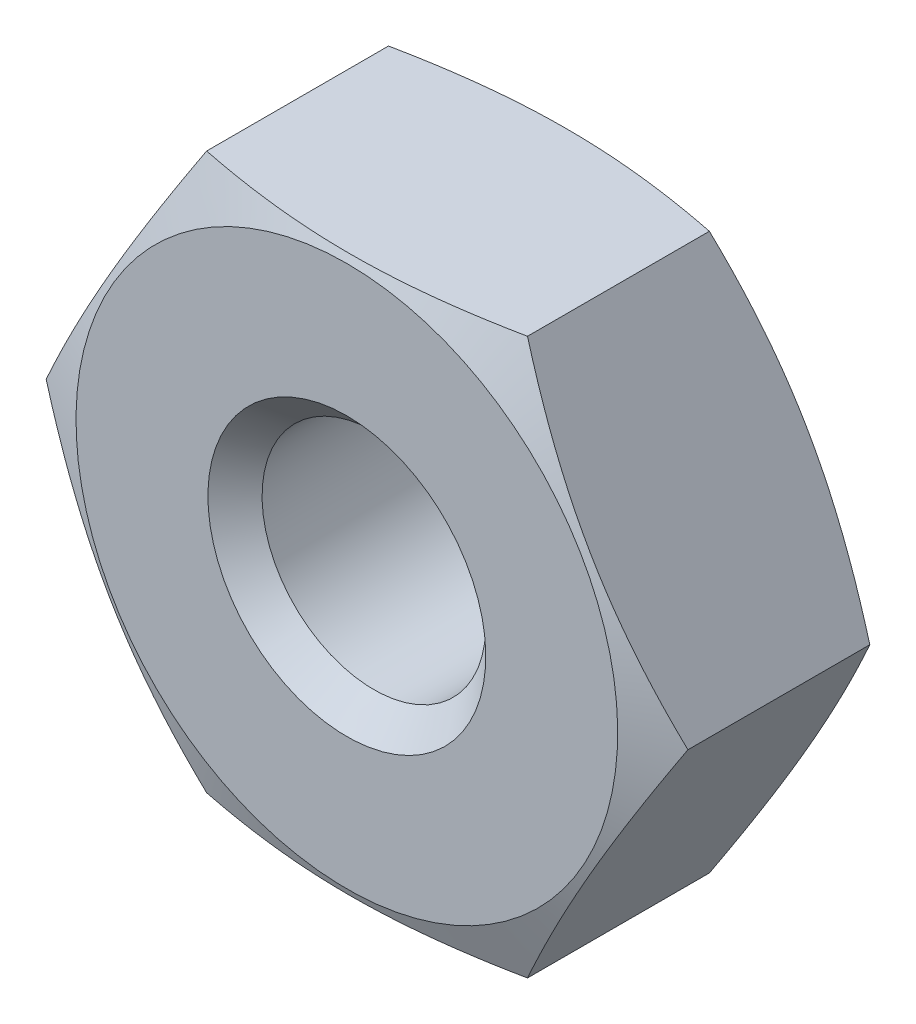
ISO-10303-21;
HEADER;
FILE_DESCRIPTION(('STEP AP214'),'2;1');
FILE_NAME('part.step','',(''),(''),'','','');
FILE_SCHEMA(('AUTOMOTIVE_DESIGN { 1 0 10303 214 1 1 1 1 }'));
ENDSEC;
DATA;
#1=APPLICATION_CONTEXT('core data for automotive mechanical design processes');
#2=APPLICATION_PROTOCOL_DEFINITION('international standard','automotive_design',2000,#1);
#3=PRODUCT_CONTEXT('',#1,'mechanical');
#4=PRODUCT('Part','Part','',(#3));
#5=PRODUCT_RELATED_PRODUCT_CATEGORY('part','',(#4));
#6=PRODUCT_DEFINITION_FORMATION('','',#4);
#7=PRODUCT_DEFINITION_CONTEXT('part definition',#1,'design');
#8=PRODUCT_DEFINITION('design','',#6,#7);
#9=PRODUCT_DEFINITION_SHAPE('','',#8);
#10=(LENGTH_UNIT() NAMED_UNIT(*) SI_UNIT(.MILLI.,.METRE.));
#11=(NAMED_UNIT(*) PLANE_ANGLE_UNIT() SI_UNIT($,.RADIAN.));
#12=(NAMED_UNIT(*) SI_UNIT($,.STERADIAN.) SOLID_ANGLE_UNIT());
#13=UNCERTAINTY_MEASURE_WITH_UNIT(LENGTH_MEASURE(1.E-05),#10,'distance_accuracy_value','');
#14=(GEOMETRIC_REPRESENTATION_CONTEXT(3) GLOBAL_UNCERTAINTY_ASSIGNED_CONTEXT((#13)) GLOBAL_UNIT_ASSIGNED_CONTEXT((#10,
#11,#12)) REPRESENTATION_CONTEXT('',''));
#15=CARTESIAN_POINT('',(0.,0.,0.));
#16=DIRECTION('',(0.,0.,1.));
#17=DIRECTION('',(1.,0.,0.));
#18=AXIS2_PLACEMENT_3D('',#15,#16,#17);
#19=CARTESIAN_POINT('',(0.,0.,0.));
#20=DIRECTION('',(0.,0.,1.));
#21=DIRECTION('',(0.,-1.,0.));
#22=AXIS2_PLACEMENT_3D('',#19,#20,#21);
#23=CONICAL_SURFACE('',#22,2.43673420846976,1.18682389135614);
#24=CARTESIAN_POINT('',(0.,0.,0.));
#25=DIRECTION('',(0.,0.,1.));
#26=DIRECTION('',(1.,0.,0.));
#27=AXIS2_PLACEMENT_3D('',#24,#25,#26);
#28=CIRCLE('',#27,2.43673420846976);
#29=CARTESIAN_POINT('',(2.43673420846977,0.,0.));
#30=VERTEX_POINT('',#29);
#31=EDGE_CURVE('E25',#30,#30,#28,.T.);
#32=ORIENTED_EDGE('',*,*,#31,.T.);
#33=EDGE_LOOP('',(#32));
#34=FACE_BOUND('',#33,.T.);
#35=CARTESIAN_POINT('',(1.44337384529946,2.50000083437473,0.181818648347762));
#36=CARTESIAN_POINT('',(1.49380150063382,2.41265757322905,0.161443358324686));
#37=CARTESIAN_POINT('',(1.54439559735179,2.32502602715047,0.142603122061379));
#38=CARTESIAN_POINT('',(1.64591833867751,2.14918348105066,0.108571814359987));
#39=CARTESIAN_POINT('',(1.69684716145278,2.06097217243421,0.0933828810858971));
#40=CARTESIAN_POINT('',(1.79896686360737,1.88409565984866,0.0672623014705703));
#41=CARTESIAN_POINT('',(1.85015766062129,1.7954305985406,0.0563293914416572));
#42=CARTESIAN_POINT('',(1.95272940810088,1.61777112048483,0.039227507737937));
#43=CARTESIAN_POINT('',(2.00411031416533,1.52877678064228,0.0330574845165583));
#44=CARTESIAN_POINT('',(2.1060899244745,1.35214291425072,0.0258650641855999));
#45=CARTESIAN_POINT('',(2.15668709609747,1.26450604228045,0.0247570380701568));
#46=CARTESIAN_POINT('',(2.2578515394539,1.0892840864677,0.0275153521862464));
#47=CARTESIAN_POINT('',(2.30841880816769,1.00169900785543,0.0313821297413788));
#48=CARTESIAN_POINT('',(2.40936777387845,0.826850270272867,0.0438818167665984));
#49=CARTESIAN_POINT('',(2.45974957523676,0.739586430543424,0.0525114195897297));
#50=CARTESIAN_POINT('',(2.560278508564,0.565465210389948,0.0741196601079492));
#51=CARTESIAN_POINT('',(2.61042563635576,0.478607837200966,0.0870983749203474));
#52=CARTESIAN_POINT('',(2.67934075605068,0.359243348479666,0.107613854795563));
#53=CARTESIAN_POINT('',(2.69823432477948,0.326518727505102,0.113517320039718));
#54=CARTESIAN_POINT('',(2.7359768691918,0.261146722976037,0.125838328397501));
#55=CARTESIAN_POINT('',(2.75482585115468,0.228499328545381,0.132255794061178));
#56=CARTESIAN_POINT('',(2.79254530829157,0.163167312350368,0.145597958519896));
#57=CARTESIAN_POINT('',(2.81141563586643,0.130482946235237,0.152524319751081));
#58=CARTESIAN_POINT('',(2.8491149459142,0.0651858258222088,0.166835389285784));
#59=CARTESIAN_POINT('',(2.86794392366967,0.0325730796951475,0.174220147332367));
#60=CARTESIAN_POINT('',(2.88675115470054,-2.00000000010866E-06,0.181818648347762));
#61=B_SPLINE_CURVE_WITH_KNOTS('',3,(#35,#36,#37,#38,#39,#40,#41,#42,#43,#44,#45,#46,#47,#48,#49,
#50,#51,#52,#53,#54,#55,#56,#57,#58,#59,#60),.UNSPECIFIED.,.F.,.F.,(4,2,2,2,2,2,2,2,2,2,2,2,4),
(0.,0.308700267066118,0.61758086774057,0.926369686288161,1.23509044089742,1.53856903844244,
1.84207431591905,2.14536914589416,2.44866935409804,2.56340370082245,2.67812079170085,
2.7932308984505,2.90835351831807),.UNSPECIFIED.);
#62=CARTESIAN_POINT('',(1.443375,2.49999883437473,0.181818181818182));
#63=VERTEX_POINT('',#62);
#64=CARTESIAN_POINT('',(2.88675,0.,0.181818181818182));
#65=VERTEX_POINT('',#64);
#66=EDGE_CURVE('E182',#63,#65,#61,.T.);
#67=ORIENTED_EDGE('',*,*,#66,.T.);
#68=CARTESIAN_POINT('',(2.88675115470054,2.00000000013623E-06,0.181818648347762));
#69=CARTESIAN_POINT('',(2.83632349936618,-0.0873412611456816,0.161443358324686));
#70=CARTESIAN_POINT('',(2.78572940264821,-0.174972807224257,0.142603122061379));
#71=CARTESIAN_POINT('',(2.68420666132249,-0.350815353324073,0.108571814359987));
#72=CARTESIAN_POINT('',(2.63327783854722,-0.439026661940524,0.0933828810858974));
#73=CARTESIAN_POINT('',(2.53115813639263,-0.61590317452607,0.0672623014705707));
#74=CARTESIAN_POINT('',(2.47996733937871,-0.704568235834127,0.0563293914416576));
#75=CARTESIAN_POINT('',(2.37739559189912,-0.882227713889894,0.0392275077379373));
#76=CARTESIAN_POINT('',(2.32601468583467,-0.971222053732445,0.0330574845165586));
#77=CARTESIAN_POINT('',(2.2240350755255,-1.14785592012401,0.0258650641856002));
#78=CARTESIAN_POINT('',(2.17343790390253,-1.23549279209427,0.0247570380701571));
#79=CARTESIAN_POINT('',(2.0722734605461,-1.41071474790703,0.0275153521862467));
#80=CARTESIAN_POINT('',(2.02170619183232,-1.4982998265193,0.0313821297413791));
#81=CARTESIAN_POINT('',(1.92075722612156,-1.67314856410186,0.0438818167665989));
#82=CARTESIAN_POINT('',(1.87037542476324,-1.76041240383131,0.0525114195897304));
#83=CARTESIAN_POINT('',(1.769846491436,-1.93453362398478,0.0741196601079493));
#84=CARTESIAN_POINT('',(1.71969936364424,-2.02139099717376,0.0870983749203467));
#85=CARTESIAN_POINT('',(1.65078424394932,-2.14075548589506,0.107613854795563));
#86=CARTESIAN_POINT('',(1.63189067522053,-2.17348010686963,0.113517320039718));
#87=CARTESIAN_POINT('',(1.5941481308082,-2.23885211139869,0.125838328397502));
#88=CARTESIAN_POINT('',(1.57529914884533,-2.27149950582935,0.132255794061178));
#89=CARTESIAN_POINT('',(1.53757969170843,-2.33683152202436,0.145597958519897));
#90=CARTESIAN_POINT('',(1.51870936413357,-2.36951588813949,0.152524319751081));
#91=CARTESIAN_POINT('',(1.4810100540858,-2.43481300855252,0.166835389285785));
#92=CARTESIAN_POINT('',(1.46218107633033,-2.46742575467958,0.174220147332368));
#93=CARTESIAN_POINT('',(1.44337384529946,-2.50000083437473,0.181818648347762));
#94=B_SPLINE_CURVE_WITH_KNOTS('',3,(#68,#69,#70,#71,#72,#73,#74,#75,#76,#77,#78,#79,#80,#81,#82,
#83,#84,#85,#86,#87,#88,#89,#90,#91,#92,#93),.UNSPECIFIED.,.F.,.F.,(4,2,2,2,2,2,2,2,2,2,2,2,4),
(0.,0.308700267066118,0.617580867740569,0.92636968628816,1.23509044089742,1.53856903844244,
1.84207431591905,2.14536914589416,2.44866935409804,2.56340370082245,2.67812079170085,
2.7932308984505,2.90835351831807),.UNSPECIFIED.);
#95=CARTESIAN_POINT('',(1.443375,-2.49999883437473,0.181818181818182));
#96=VERTEX_POINT('',#95);
#97=EDGE_CURVE('E32',#65,#96,#94,.T.);
#98=ORIENTED_EDGE('',*,*,#97,.T.);
#99=CARTESIAN_POINT('',(-3.82095012039112,-2.49999883437473,0.860336647703105));
#100=CARTESIAN_POINT('',(-3.70812640698267,-2.49999883437473,0.822202999527089));
#101=CARTESIAN_POINT('',(-3.59515293929073,-2.49999883437473,0.784504297759336));
#102=CARTESIAN_POINT('',(-3.36882897133592,-2.49999883437473,0.710219784795558));
#103=CARTESIAN_POINT('',(-3.25547843545052,-2.49999883437473,0.673634082262172));
#104=CARTESIAN_POINT('',(-3.02807210177579,-2.49999883437473,0.601739889293614));
#105=CARTESIAN_POINT('',(-2.91401526414519,-2.49999883437473,0.566434675909466));
#106=CARTESIAN_POINT('',(-2.68538749897235,-2.49999883437473,0.497533761155445));
#107=CARTESIAN_POINT('',(-2.57081658392916,-2.49999883437473,0.463938018464759));
#108=CARTESIAN_POINT('',(-2.34254238696596,-2.49999883437473,0.399304782693489));
#109=CARTESIAN_POINT('',(-2.22884688744743,-2.49999883437473,0.368239952709745));
#110=CARTESIAN_POINT('',(-2.00076606745772,-2.49999883437473,0.308724962615925));
#111=CARTESIAN_POINT('',(-1.88638072619808,-2.49999883437473,0.280274881725402));
#112=CARTESIAN_POINT('',(-1.65690113909925,-2.49999883437473,0.226669182391994));
#113=CARTESIAN_POINT('',(-1.54180734834386,-2.49999883437473,0.201511641669614));
#114=CARTESIAN_POINT('',(-1.31080939382723,-2.49999883437473,0.155260021096282));
#115=CARTESIAN_POINT('',(-1.19490523748913,-2.49999883437473,0.134165904073773));
#116=CARTESIAN_POINT('',(-0.893517226996432,-2.49999883437473,0.0859468081249089));
#117=CARTESIAN_POINT('',(-0.707380653610788,-2.49999883437473,0.0626213718136777));
#118=CARTESIAN_POINT('',(-0.427276948633426,-2.49999883437473,0.0395373983347069));
#119=CARTESIAN_POINT('',(-0.333781962519812,-2.49999883437473,0.033826713673377));
#120=CARTESIAN_POINT('',(-0.146624208612679,-2.49999883437473,0.0265975302551872));
#121=CARTESIAN_POINT('',(-0.0529614421923298,-2.49999883437473,0.0250789973438281));
#122=CARTESIAN_POINT('',(0.134787158470577,-2.49999883437473,0.0263126243651685));
#123=CARTESIAN_POINT('',(0.22887285034968,-2.49999883437473,0.0290854536775406));
#124=CARTESIAN_POINT('',(0.416828811351815,-2.49999883437473,0.038811128526107));
#125=CARTESIAN_POINT('',(0.51069907141184,-2.49999883437473,0.0457641467964522));
#126=CARTESIAN_POINT('',(0.698125412636558,-2.49999883437473,0.063557235924569));
#127=CARTESIAN_POINT('',(0.791681259560371,-2.49999883437473,0.0743997443516532));
#128=CARTESIAN_POINT('',(0.97831674892868,-2.49999883437473,0.0995635838468456));
#129=CARTESIAN_POINT('',(1.07139639289796,-2.49999883437473,0.11388490376878));
#130=CARTESIAN_POINT('',(1.38167106617322,-2.49999883437473,0.166798063451352));
#131=CARTESIAN_POINT('',(1.59771260927183,-2.49999883437473,0.212159375560713));
#132=CARTESIAN_POINT('',(2.02717640457874,-2.49999883437473,0.313993556904504));
#133=CARTESIAN_POINT('',(2.24059696111488,-2.49999883437473,0.370473254452842));
#134=CARTESIAN_POINT('',(2.66593213636662,-2.49999883437473,0.490836171588015));
#135=CARTESIAN_POINT('',(2.87784119303891,-2.49999883437473,0.554738808884069));
#136=CARTESIAN_POINT('',(3.30007173255107,-2.49999883437473,0.687347883506669));
#137=CARTESIAN_POINT('',(3.51039361323442,-2.49999883437473,0.756053069491841));
#138=CARTESIAN_POINT('',(3.92853554871831,-2.49999883437473,0.896276186437608));
#139=CARTESIAN_POINT('',(4.13636293881109,-2.49999883437473,0.967772363120408));
#140=CARTESIAN_POINT('',(4.55123199761895,-2.49999883437473,1.11305063830255));
#141=CARTESIAN_POINT('',(4.75827360448942,-2.49999883437473,1.18683291270511));
#142=CARTESIAN_POINT('',(5.17037915089057,-2.49999883437473,1.33554374339837));
#143=CARTESIAN_POINT('',(5.37544705783706,-2.49999883437473,1.41046133746816));
#144=CARTESIAN_POINT('',(5.78510152000918,-2.49999883437473,1.56152127761758));
#145=CARTESIAN_POINT('',(5.98968813418635,-2.49999883437473,1.63766346367406));
#146=CARTESIAN_POINT('',(6.1941137083983,-2.49999883437473,1.71422852758777));
#147=B_SPLINE_CURVE_WITH_KNOTS('',3,(#99,#100,#101,#102,#103,#104,#105,#106,#107,#108,#109,#110,
#111,#112,#113,#114,#115,#116,#117,#118,#119,#120,#121,#122,#123,#124,#125,#126,#127,#128,#129,
#130,#131,#132,#133,#134,#135,#136,#137,#138,#139,#140,#141,#142,#143,#144,#145,#146),
.UNSPECIFIED.,.F.,.F.,(4,2,2,2,2,2,2,2,2,2,2,2,2,2,2,2,2,2,2,2,2,2,2,4),(0.,0.357284811121702,
0.714604392906672,1.07278178968343,1.43095052458696,1.78451450676743,2.13808919741472,
2.49145653129559,2.84482063247455,3.40694826741191,3.68787621684392,3.96880187747956,
4.2510848356553,4.53337945915508,4.81585130853777,5.09832225288758,5.76005616517802,
6.42219775388156,7.08611219706152,7.74985429239632,8.40918050650748,9.06855757891345,
9.72352608063887,10.3784096789851),.UNSPECIFIED.);
#148=CARTESIAN_POINT('',(-1.443375,-2.49999883437473,0.181818181818182));
#149=VERTEX_POINT('',#148);
#150=EDGE_CURVE('E75',#96,#149,#147,.F.);
#151=ORIENTED_EDGE('',*,*,#150,.T.);
#152=CARTESIAN_POINT('',(-1.44337384529946,-2.50000083437473,0.181818648347762));
#153=CARTESIAN_POINT('',(-1.49380150063382,-2.41265757322905,0.161443358324686));
#154=CARTESIAN_POINT('',(-1.54439559735179,-2.32502602715047,0.142603122061379));
#155=CARTESIAN_POINT('',(-1.64591833867751,-2.14918348105066,0.108571814359987));
#156=CARTESIAN_POINT('',(-1.69684716145278,-2.0609721724342,0.0933828810858973));
#157=CARTESIAN_POINT('',(-1.79896686360737,-1.88409565984866,0.0672623014705704));
#158=CARTESIAN_POINT('',(-1.85015766062129,-1.7954305985406,0.0563293914416572));
#159=CARTESIAN_POINT('',(-1.95272940810088,-1.61777112048483,0.0392275077379369));
#160=CARTESIAN_POINT('',(-2.00411031416533,-1.52877678064228,0.0330574845165584));
#161=CARTESIAN_POINT('',(-2.1060899244745,-1.35214291425072,0.0258650641856001));
#162=CARTESIAN_POINT('',(-2.15668709609747,-1.26450604228045,0.0247570380701569));
#163=CARTESIAN_POINT('',(-2.2578515394539,-1.0892840864677,0.0275153521862465));
#164=CARTESIAN_POINT('',(-2.30841880816769,-1.00169900785543,0.0313821297413789));
#165=CARTESIAN_POINT('',(-2.40936777387845,-0.826850270272866,0.0438818167665985));
#166=CARTESIAN_POINT('',(-2.45974957523676,-0.739586430543423,0.0525114195897298));
#167=CARTESIAN_POINT('',(-2.560278508564,-0.565465210389946,0.0741196601079493));
#168=CARTESIAN_POINT('',(-2.61042563635576,-0.478607837200964,0.0870983749203476));
#169=CARTESIAN_POINT('',(-2.67934075605068,-0.359243348479665,0.107613854795563));
#170=CARTESIAN_POINT('',(-2.69823432477948,-0.326518727505101,0.113517320039718));
#171=CARTESIAN_POINT('',(-2.7359768691918,-0.261146722976036,0.125838328397501));
#172=CARTESIAN_POINT('',(-2.75482585115468,-0.228499328545381,0.132255794061178));
#173=CARTESIAN_POINT('',(-2.79254530829157,-0.163167312350367,0.145597958519896));
#174=CARTESIAN_POINT('',(-2.81141563586643,-0.130482946235237,0.152524319751081));
#175=CARTESIAN_POINT('',(-2.8491149459142,-0.0651858258222087,0.166835389285784));
#176=CARTESIAN_POINT('',(-2.86794392366967,-0.0325730796951475,0.174220147332367));
#177=CARTESIAN_POINT('',(-2.88675115470054,1.99999999946494E-06,0.181818648347762));
#178=B_SPLINE_CURVE_WITH_KNOTS('',3,(#152,#153,#154,#155,#156,#157,#158,#159,#160,#161,#162,
#163,#164,#165,#166,#167,#168,#169,#170,#171,#172,#173,#174,#175,#176,#177),.UNSPECIFIED.,.F.,
.F.,(4,2,2,2,2,2,2,2,2,2,2,2,4),(0.,0.308700267066118,0.61758086774057,0.926369686288161,
1.23509044089742,1.53856903844244,1.84207431591905,2.14536914589417,2.44866935409805,
2.56340370082245,2.67812079170085,2.7932308984505,2.90835351831807),.UNSPECIFIED.);
#179=CARTESIAN_POINT('',(-2.88675,0.,0.181818181818182));
#180=VERTEX_POINT('',#179);
#181=EDGE_CURVE('E86',#149,#180,#178,.T.);
#182=ORIENTED_EDGE('',*,*,#181,.T.);
#183=CARTESIAN_POINT('',(-2.88675115470054,-2.00000000083267E-06,0.181818648347762));
#184=CARTESIAN_POINT('',(-2.83632349936618,0.0873412611456814,0.161443358324686));
#185=CARTESIAN_POINT('',(-2.78572940264821,0.174972807224257,0.142603122061379));
#186=CARTESIAN_POINT('',(-2.68420666132249,0.350815353324073,0.108571814359987));
#187=CARTESIAN_POINT('',(-2.63327783854722,0.439026661940524,0.0933828810858971));
#188=CARTESIAN_POINT('',(-2.53115813639263,0.61590317452607,0.0672623014705705));
#189=CARTESIAN_POINT('',(-2.47996733937871,0.704568235834127,0.0563293914416574));
#190=CARTESIAN_POINT('',(-2.37739559189912,0.882227713889894,0.0392275077379373));
#191=CARTESIAN_POINT('',(-2.32601468583467,0.971222053732445,0.0330574845165586));
#192=CARTESIAN_POINT('',(-2.2240350755255,1.14785592012401,0.0258650641856002));
#193=CARTESIAN_POINT('',(-2.17343790390253,1.23549279209427,0.024757038070157));
#194=CARTESIAN_POINT('',(-2.0722734605461,1.41071474790703,0.0275153521862466));
#195=CARTESIAN_POINT('',(-2.02170619183232,1.4982998265193,0.031382129741379));
#196=CARTESIAN_POINT('',(-1.92075722612156,1.67314856410186,0.0438818167665988));
#197=CARTESIAN_POINT('',(-1.87037542476324,1.76041240383131,0.0525114195897302));
#198=CARTESIAN_POINT('',(-1.769846491436,1.93453362398478,0.0741196601079491));
#199=CARTESIAN_POINT('',(-1.71969936364424,2.02139099717376,0.0870983749203465));
#200=CARTESIAN_POINT('',(-1.65078424394932,2.14075548589506,0.107613854795563));
#201=CARTESIAN_POINT('',(-1.63189067522053,2.17348010686963,0.113517320039718));
#202=CARTESIAN_POINT('',(-1.5941481308082,2.23885211139869,0.125838328397501));
#203=CARTESIAN_POINT('',(-1.57529914884533,2.27149950582935,0.132255794061178));
#204=CARTESIAN_POINT('',(-1.53757969170843,2.33683152202436,0.145597958519896));
#205=CARTESIAN_POINT('',(-1.51870936413357,2.36951588813949,0.152524319751081));
#206=CARTESIAN_POINT('',(-1.4810100540858,2.43481300855252,0.166835389285784));
#207=CARTESIAN_POINT('',(-1.46218107633033,2.46742575467958,0.174220147332367));
#208=CARTESIAN_POINT('',(-1.44337384529946,2.50000083437473,0.181818648347762));
#209=B_SPLINE_CURVE_WITH_KNOTS('',3,(#183,#184,#185,#186,#187,#188,#189,#190,#191,#192,#193,
#194,#195,#196,#197,#198,#199,#200,#201,#202,#203,#204,#205,#206,#207,#208),.UNSPECIFIED.,.F.,
.F.,(4,2,2,2,2,2,2,2,2,2,2,2,4),(0.,0.308700267066118,0.61758086774057,0.92636968628816,
1.23509044089742,1.53856903844244,1.84207431591905,2.14536914589416,2.44866935409804,
2.56340370082245,2.67812079170085,2.7932308984505,2.90835351831807),.UNSPECIFIED.);
#210=CARTESIAN_POINT('',(-1.443375,2.49999883437473,0.181818181818182));
#211=VERTEX_POINT('',#210);
#212=EDGE_CURVE('E92',#180,#211,#209,.T.);
#213=ORIENTED_EDGE('',*,*,#212,.T.);
#214=CARTESIAN_POINT('',(-3.82095012039112,2.49999883437473,0.860336647703105));
#215=CARTESIAN_POINT('',(-3.70812640698267,2.49999883437473,0.822202999527089));
#216=CARTESIAN_POINT('',(-3.59515293929074,2.49999883437473,0.784504297759336));
#217=CARTESIAN_POINT('',(-3.36882897133592,2.49999883437473,0.710219784795559));
#218=CARTESIAN_POINT('',(-3.25547843545052,2.49999883437473,0.673634082262172));
#219=CARTESIAN_POINT('',(-3.02807210177579,2.49999883437473,0.601739889293614));
#220=CARTESIAN_POINT('',(-2.91401526414519,2.49999883437473,0.566434675909467));
#221=CARTESIAN_POINT('',(-2.68538749897235,2.49999883437473,0.497533761155445));
#222=CARTESIAN_POINT('',(-2.57081658392916,2.49999883437473,0.463938018464759));
#223=CARTESIAN_POINT('',(-2.34254238696596,2.49999883437473,0.399304782693489));
#224=CARTESIAN_POINT('',(-2.22884688744743,2.49999883437473,0.368239952709745));
#225=CARTESIAN_POINT('',(-2.00076606745772,2.49999883437473,0.308724962615925));
#226=CARTESIAN_POINT('',(-1.88638072619808,2.49999883437473,0.280274881725401));
#227=CARTESIAN_POINT('',(-1.65690113909925,2.49999883437473,0.226669182391993));
#228=CARTESIAN_POINT('',(-1.54180734834386,2.49999883437473,0.201511641669614));
#229=CARTESIAN_POINT('',(-1.31080939382723,2.49999883437473,0.155260021096281));
#230=CARTESIAN_POINT('',(-1.19490523748913,2.49999883437473,0.134165904073773));
#231=CARTESIAN_POINT('',(-0.893517226996432,2.49999883437473,0.0859468081249084));
#232=CARTESIAN_POINT('',(-0.707380653610787,2.49999883437473,0.0626213718136773));
#233=CARTESIAN_POINT('',(-0.427276948633425,2.49999883437473,0.0395373983347063));
#234=CARTESIAN_POINT('',(-0.333781962519811,2.49999883437473,0.0338267136733763));
#235=CARTESIAN_POINT('',(-0.146624208612678,2.49999883437473,0.0265975302551866));
#236=CARTESIAN_POINT('',(-0.0529614421923291,2.49999883437473,0.0250789973438276));
#237=CARTESIAN_POINT('',(0.134787158470577,2.49999883437473,0.0263126243651682));
#238=CARTESIAN_POINT('',(0.228872850349681,2.49999883437473,0.0290854536775402));
#239=CARTESIAN_POINT('',(0.416828811351816,2.49999883437473,0.0388111285261065));
#240=CARTESIAN_POINT('',(0.510699071411841,2.49999883437473,0.0457641467964517));
#241=CARTESIAN_POINT('',(0.698125412636559,2.49999883437473,0.0635572359245683));
#242=CARTESIAN_POINT('',(0.791681259560372,2.49999883437473,0.0743997443516525));
#243=CARTESIAN_POINT('',(0.978316748928682,2.49999883437473,0.0995635838468449));
#244=CARTESIAN_POINT('',(1.07139639289797,2.49999883437473,0.113884903768779));
#245=CARTESIAN_POINT('',(1.38167106617322,2.49999883437473,0.166798063451352));
#246=CARTESIAN_POINT('',(1.59771260927183,2.49999883437473,0.212159375560713));
#247=CARTESIAN_POINT('',(2.02717640457874,2.49999883437473,0.313993556904503));
#248=CARTESIAN_POINT('',(2.24059696111488,2.49999883437473,0.370473254452841));
#249=CARTESIAN_POINT('',(2.66593213636662,2.49999883437473,0.490836171588015));
#250=CARTESIAN_POINT('',(2.87784119303892,2.49999883437473,0.554738808884068));
#251=CARTESIAN_POINT('',(3.30007173255107,2.49999883437473,0.687347883506669));
#252=CARTESIAN_POINT('',(3.51039361323442,2.49999883437473,0.756053069491841));
#253=CARTESIAN_POINT('',(3.92853554871832,2.49999883437473,0.896276186437608));
#254=CARTESIAN_POINT('',(4.13636293881109,2.49999883437473,0.967772363120407));
#255=CARTESIAN_POINT('',(4.55123199761895,2.49999883437473,1.11305063830255));
#256=CARTESIAN_POINT('',(4.75827360448943,2.49999883437473,1.18683291270511));
#257=CARTESIAN_POINT('',(5.17037915089057,2.49999883437473,1.33554374339837));
#258=CARTESIAN_POINT('',(5.37544705783707,2.49999883437473,1.41046133746816));
#259=CARTESIAN_POINT('',(5.78510152000918,2.49999883437473,1.56152127761758));
#260=CARTESIAN_POINT('',(5.98968813418635,2.49999883437473,1.63766346367406));
#261=CARTESIAN_POINT('',(6.1941137083983,2.49999883437473,1.71422852758777));
#262=B_SPLINE_CURVE_WITH_KNOTS('',3,(#214,#215,#216,#217,#218,#219,#220,#221,#222,#223,#224,
#225,#226,#227,#228,#229,#230,#231,#232,#233,#234,#235,#236,#237,#238,#239,#240,#241,#242,#243,
#244,#245,#246,#247,#248,#249,#250,#251,#252,#253,#254,#255,#256,#257,#258,#259,#260,#261),
.UNSPECIFIED.,.F.,.F.,(4,2,2,2,2,2,2,2,2,2,2,2,2,2,2,2,2,2,2,2,2,2,2,4),(0.,0.357284811121702,
0.714604392906671,1.07278178968343,1.43095052458696,1.78451450676743,2.13808919741472,
2.49145653129559,2.84482063247455,3.40694826741191,3.68787621684392,3.96880187747956,
4.2510848356553,4.53337945915508,4.81585130853777,5.09832225288758,5.76005616517802,
6.42219775388156,7.08611219706152,7.74985429239632,8.40918050650748,9.06855757891345,
9.72352608063887,10.3784096789851),.UNSPECIFIED.);
#263=EDGE_CURVE('E188',#211,#63,#262,.T.);
#264=ORIENTED_EDGE('',*,*,#263,.T.);
#265=EDGE_LOOP('',(#67,#98,#151,#182,#213,#264));
#266=FACE_BOUND('',#265,.T.);
#267=ADVANCED_FACE('F15',(#34,#266),#23,.T.);
#268=CARTESIAN_POINT('',(2.88675,0.,0.));
#269=DIRECTION('',(0.,0.,1.));
#270=DIRECTION('',(1.,0.,0.));
#271=AXIS2_PLACEMENT_3D('',#268,#269,#270);
#272=PLANE('',#271);
#273=CARTESIAN_POINT('',(0.,0.,0.));
#274=DIRECTION('',(0.,0.,1.));
#275=DIRECTION('',(1.,0.,0.));
#276=AXIS2_PLACEMENT_3D('',#273,#274,#275);
#277=CIRCLE('',#276,1.25);
#278=CARTESIAN_POINT('',(1.25,0.,0.));
#279=VERTEX_POINT('',#278);
#280=EDGE_CURVE('E10',#279,#279,#277,.F.);
#281=ORIENTED_EDGE('',*,*,#280,.F.);
#282=EDGE_LOOP('',(#281));
#283=FACE_BOUND('',#282,.T.);
#284=ORIENTED_EDGE('',*,*,#31,.F.);
#285=EDGE_LOOP('',(#284));
#286=FACE_BOUND('',#285,.T.);
#287=ADVANCED_FACE('F210',(#283,#286),#272,.F.);
#288=CARTESIAN_POINT('',(0.,0.,2.));
#289=DIRECTION('',(0.,0.,1.));
#290=DIRECTION('',(0.,-1.,0.));
#291=AXIS2_PLACEMENT_3D('',#288,#289,#290);
#292=CONICAL_SURFACE('',#291,1.25,0.785398163397448);
#293=CARTESIAN_POINT('',(0.,0.,1.7564375));
#294=DIRECTION('',(0.,0.,-1.));
#295=DIRECTION('',(0.,1.,0.));
#296=AXIS2_PLACEMENT_3D('',#293,#294,#295);
#297=CIRCLE('',#296,1.0064375);
#298=CARTESIAN_POINT('',(0.,1.0064375,1.7564375));
#299=VERTEX_POINT('',#298);
#300=EDGE_CURVE('E352',#299,#299,#297,.T.);
#301=ORIENTED_EDGE('',*,*,#300,.T.);
#302=EDGE_LOOP('',(#301));
#303=FACE_BOUND('',#302,.T.);
#304=CARTESIAN_POINT('',(0.,0.,2.));
#305=DIRECTION('',(0.,0.,-1.));
#306=DIRECTION('',(0.,1.,0.));
#307=AXIS2_PLACEMENT_3D('',#304,#305,#306);
#308=CIRCLE('',#307,1.25);
#309=CARTESIAN_POINT('',(0.,1.25,2.));
#310=VERTEX_POINT('',#309);
#311=EDGE_CURVE('E103',#310,#310,#308,.T.);
#312=ORIENTED_EDGE('',*,*,#311,.F.);
#313=EDGE_LOOP('',(#312));
#314=FACE_BOUND('',#313,.T.);
#315=ADVANCED_FACE('F148',(#303,#314),#292,.F.);
#316=CARTESIAN_POINT('',(0.,0.,0.));
#317=DIRECTION('',(0.,0.,-1.));
#318=DIRECTION('',(0.,1.,0.));
#319=AXIS2_PLACEMENT_3D('',#316,#317,#318);
#320=CYLINDRICAL_SURFACE('',#319,1.0064375);
#321=CARTESIAN_POINT('',(0.,0.,0.2435625));
#322=DIRECTION('',(0.,0.,-1.));
#323=DIRECTION('',(0.,1.,0.));
#324=AXIS2_PLACEMENT_3D('',#321,#322,#323);
#325=CIRCLE('',#324,1.0064375);
#326=CARTESIAN_POINT('',(0.,1.0064375,0.2435625));
#327=VERTEX_POINT('',#326);
#328=EDGE_CURVE('E356',#327,#327,#325,.T.);
#329=ORIENTED_EDGE('',*,*,#328,.T.);
#330=EDGE_LOOP('',(#329));
#331=FACE_BOUND('',#330,.T.);
#332=ORIENTED_EDGE('',*,*,#300,.F.);
#333=EDGE_LOOP('',(#332));
#334=FACE_BOUND('',#333,.T.);
#335=ADVANCED_FACE('F318',(#331,#334),#320,.F.);
#336=CARTESIAN_POINT('',(0.,0.,0.2435625));
#337=DIRECTION('',(0.,0.,-1.));
#338=DIRECTION('',(0.,1.,0.));
#339=AXIS2_PLACEMENT_3D('',#336,#337,#338);
#340=CONICAL_SURFACE('',#339,1.0064375,0.785398163397448);
#341=ORIENTED_EDGE('',*,*,#280,.T.);
#342=EDGE_LOOP('',(#341));
#343=FACE_BOUND('',#342,.T.);
#344=ORIENTED_EDGE('',*,*,#328,.F.);
#345=EDGE_LOOP('',(#344));
#346=FACE_BOUND('',#345,.T.);
#347=ADVANCED_FACE('F309',(#343,#346),#340,.F.);
#348=CARTESIAN_POINT('',(2.88675,0.,2.));
#349=DIRECTION('',(0.,0.,1.));
#350=DIRECTION('',(1.,0.,0.));
#351=AXIS2_PLACEMENT_3D('',#348,#349,#350);
#352=PLANE('',#351);
#353=CARTESIAN_POINT('',(0.,0.,2.));
#354=DIRECTION('',(0.,0.,-1.));
#355=DIRECTION('',(0.,1.,0.));
#356=AXIS2_PLACEMENT_3D('',#353,#354,#355);
#357=CIRCLE('',#356,2.43673420846976);
#358=CARTESIAN_POINT('',(0.,2.43673420846976,2.));
#359=VERTEX_POINT('',#358);
#360=EDGE_CURVE('E96',#359,#359,#357,.T.);
#361=ORIENTED_EDGE('',*,*,#360,.F.);
#362=EDGE_LOOP('',(#361));
#363=FACE_BOUND('',#362,.T.);
#364=ORIENTED_EDGE('',*,*,#311,.T.);
#365=EDGE_LOOP('',(#364));
#366=FACE_BOUND('',#365,.T.);
#367=ADVANCED_FACE('F122',(#363,#366),#352,.T.);
#368=CARTESIAN_POINT('',(0.,0.,1.81818181818182));
#369=DIRECTION('',(0.,0.,-1.));
#370=DIRECTION('',(0.,1.,0.));
#371=AXIS2_PLACEMENT_3D('',#368,#369,#370);
#372=CONICAL_SURFACE('',#371,2.88675,1.18682389135614);
#373=ORIENTED_EDGE('',*,*,#360,.T.);
#374=EDGE_LOOP('',(#373));
#375=FACE_BOUND('',#374,.T.);
#376=CARTESIAN_POINT('',(-3.82095012039112,-2.49999883437473,1.13966335229689));
#377=CARTESIAN_POINT('',(-3.70812640698267,-2.49999883437473,1.17779700047291));
#378=CARTESIAN_POINT('',(-3.59515293929074,-2.49999883437473,1.21549570224067));
#379=CARTESIAN_POINT('',(-3.36882897133592,-2.49999883437473,1.28978021520444));
#380=CARTESIAN_POINT('',(-3.25547843545052,-2.49999883437473,1.32636591773783));
#381=CARTESIAN_POINT('',(-3.0280721017758,-2.49999883437473,1.39826011070639));
#382=CARTESIAN_POINT('',(-2.91401526414519,-2.49999883437473,1.43356532409054));
#383=CARTESIAN_POINT('',(-2.68538749897235,-2.49999883437473,1.50246623884456));
#384=CARTESIAN_POINT('',(-2.57081658392916,-2.49999883437473,1.53606198153524));
#385=CARTESIAN_POINT('',(-2.34254238696596,-2.49999883437473,1.60069521730651));
#386=CARTESIAN_POINT('',(-2.22884688744743,-2.49999883437473,1.63176004729026));
#387=CARTESIAN_POINT('',(-2.00076606745772,-2.49999883437473,1.69127503738408));
#388=CARTESIAN_POINT('',(-1.88638072619808,-2.49999883437473,1.7197251182746));
#389=CARTESIAN_POINT('',(-1.65690113909925,-2.49999883437473,1.77333081760801));
#390=CARTESIAN_POINT('',(-1.54180734834386,-2.49999883437473,1.79848835833039));
#391=CARTESIAN_POINT('',(-1.31080939382723,-2.49999883437473,1.84473997890372));
#392=CARTESIAN_POINT('',(-1.19490523748913,-2.49999883437473,1.86583409592623));
#393=CARTESIAN_POINT('',(-0.893517226996432,-2.49999883437473,1.91405319187509));
#394=CARTESIAN_POINT('',(-0.707380653610788,-2.49999883437473,1.93737862818632));
#395=CARTESIAN_POINT('',(-0.427276948633426,-2.49999883437473,1.9604626016653));
#396=CARTESIAN_POINT('',(-0.333781962519811,-2.49999883437473,1.96617328632663));
#397=CARTESIAN_POINT('',(-0.146624208612679,-2.49999883437473,1.97340246974482));
#398=CARTESIAN_POINT('',(-0.0529614421923295,-2.49999883437473,1.97492100265617));
#399=CARTESIAN_POINT('',(0.134787158470577,-2.49999883437473,1.97368737563483));
#400=CARTESIAN_POINT('',(0.22887285034968,-2.49999883437473,1.97091454632246));
#401=CARTESIAN_POINT('',(0.416828811351814,-2.49999883437473,1.9611888714739));
#402=CARTESIAN_POINT('',(0.51069907141184,-2.49999883437473,1.95423585320355));
#403=CARTESIAN_POINT('',(0.698125412636557,-2.49999883437473,1.93644276407543));
#404=CARTESIAN_POINT('',(0.79168125956037,-2.49999883437473,1.92560025564835));
#405=CARTESIAN_POINT('',(0.97831674892868,-2.49999883437473,1.90043641615316));
#406=CARTESIAN_POINT('',(1.07139639289796,-2.49999883437473,1.88611509623122));
#407=CARTESIAN_POINT('',(1.38167106617322,-2.49999883437473,1.83320193654865));
#408=CARTESIAN_POINT('',(1.59771260927183,-2.49999883437473,1.78784062443929));
#409=CARTESIAN_POINT('',(2.02717640457874,-2.49999883437473,1.6860064430955));
#410=CARTESIAN_POINT('',(2.24059696111488,-2.49999883437473,1.62952674554716));
#411=CARTESIAN_POINT('',(2.66593213636661,-2.49999883437473,1.50916382841199));
#412=CARTESIAN_POINT('',(2.87784119303891,-2.49999883437473,1.44526119111593));
#413=CARTESIAN_POINT('',(3.30007173255107,-2.49999883437473,1.31265211649333));
#414=CARTESIAN_POINT('',(3.51039361323442,-2.49999883437473,1.24394693050816));
#415=CARTESIAN_POINT('',(3.92853554871831,-2.49999883437473,1.1037238135624));
#416=CARTESIAN_POINT('',(4.13636293881109,-2.49999883437473,1.0322276368796));
#417=CARTESIAN_POINT('',(4.55123199761894,-2.49999883437473,0.886949361697452));
#418=CARTESIAN_POINT('',(4.75827360448942,-2.49999883437473,0.81316708729489));
#419=CARTESIAN_POINT('',(5.17037915089057,-2.49999883437473,0.664456256601636));
#420=CARTESIAN_POINT('',(5.37544705783706,-2.49999883437473,0.589538662531844));
#421=CARTESIAN_POINT('',(5.78510152000918,-2.49999883437473,0.438478722382421));
#422=CARTESIAN_POINT('',(5.98968813418635,-2.49999883437473,0.362336536325946));
#423=CARTESIAN_POINT('',(6.1941137083983,-2.49999883437473,0.285771472412231));
#424=B_SPLINE_CURVE_WITH_KNOTS('',3,(#376,#377,#378,#379,#380,#381,#382,#383,#384,#385,#386,
#387,#388,#389,#390,#391,#392,#393,#394,#395,#396,#397,#398,#399,#400,#401,#402,#403,#404,#405,
#406,#407,#408,#409,#410,#411,#412,#413,#414,#415,#416,#417,#418,#419,#420,#421,#422,#423),
.UNSPECIFIED.,.F.,.F.,(4,2,2,2,2,2,2,2,2,2,2,2,2,2,2,2,2,2,2,2,2,2,2,4),(0.,0.357284811121703,
0.714604392906671,1.07278178968343,1.43095052458696,1.78451450676743,2.13808919741472,
2.49145653129559,2.84482063247455,3.40694826741191,3.68787621684392,3.96880187747956,
4.2510848356553,4.53337945915508,4.81585130853777,5.09832225288758,5.76005616517802,
6.42219775388155,7.08611219706151,7.74985429239632,8.40918050650747,9.06855757891345,
9.72352608063887,10.3784096789851),.UNSPECIFIED.);
#425=CARTESIAN_POINT('',(-1.443375,-2.49999883437473,1.81818181818182));
#426=VERTEX_POINT('',#425);
#427=CARTESIAN_POINT('',(1.443375,-2.49999883437473,1.81818181818182));
#428=VERTEX_POINT('',#427);
#429=EDGE_CURVE('E77',#426,#428,#424,.T.);
#430=ORIENTED_EDGE('',*,*,#429,.T.);
#431=CARTESIAN_POINT('',(1.44337384529946,-2.50000083437473,1.81818135165224));
#432=CARTESIAN_POINT('',(1.49380150063382,-2.41265757322905,1.83855664167532));
#433=CARTESIAN_POINT('',(1.54439559735179,-2.32502602715047,1.85739687793862));
#434=CARTESIAN_POINT('',(1.64591833867751,-2.14918348105066,1.89142818564001));
#435=CARTESIAN_POINT('',(1.69684716145278,-2.06097217243421,1.9066171189141));
#436=CARTESIAN_POINT('',(1.79896686360737,-1.88409565984866,1.93273769852943));
#437=CARTESIAN_POINT('',(1.85015766062129,-1.7954305985406,1.94367060855834));
#438=CARTESIAN_POINT('',(1.95272940810088,-1.61777112048484,1.96077249226206));
#439=CARTESIAN_POINT('',(2.00411031416533,-1.52877678064229,1.96694251548344));
#440=CARTESIAN_POINT('',(2.1060899244745,-1.35214291425072,1.9741349358144));
#441=CARTESIAN_POINT('',(2.15668709609747,-1.26450604228046,1.97524296192984));
#442=CARTESIAN_POINT('',(2.2578515394539,-1.0892840864677,1.97248464781376));
#443=CARTESIAN_POINT('',(2.30841880816769,-1.00169900785543,1.96861787025862));
#444=CARTESIAN_POINT('',(2.40936777387845,-0.826850270272868,1.9561181832334));
#445=CARTESIAN_POINT('',(2.45974957523676,-0.739586430543424,1.94748858041027));
#446=CARTESIAN_POINT('',(2.560278508564,-0.565465210389948,1.92588033989205));
#447=CARTESIAN_POINT('',(2.61042563635576,-0.478607837200966,1.91290162507965));
#448=CARTESIAN_POINT('',(2.67934075605068,-0.359243348479668,1.89238614520444));
#449=CARTESIAN_POINT('',(2.69823432477947,-0.326518727505104,1.88648267996028));
#450=CARTESIAN_POINT('',(2.7359768691918,-0.261146722976038,1.8741616716025));
#451=CARTESIAN_POINT('',(2.75482585115468,-0.228499328545382,1.86774420593882));
#452=CARTESIAN_POINT('',(2.79254530829157,-0.163167312350368,1.85440204148011));
#453=CARTESIAN_POINT('',(2.81141563586643,-0.130482946235238,1.84747568024892));
#454=CARTESIAN_POINT('',(2.8491149459142,-0.0651858258222091,1.83316461071422));
#455=CARTESIAN_POINT('',(2.86794392366967,-0.0325730796951475,1.82577985266763));
#456=CARTESIAN_POINT('',(2.88675115470054,2.00000000032606E-06,1.81818135165224));
#457=B_SPLINE_CURVE_WITH_KNOTS('',3,(#431,#432,#433,#434,#435,#436,#437,#438,#439,#440,#441,
#442,#443,#444,#445,#446,#447,#448,#449,#450,#451,#452,#453,#454,#455,#456),.UNSPECIFIED.,.F.,
.F.,(4,2,2,2,2,2,2,2,2,2,2,2,4),(0.,0.308700267066118,0.61758086774057,0.926369686288161,
1.23509044089742,1.53856903844244,1.84207431591905,2.14536914589416,2.44866935409804,
2.56340370082245,2.67812079170085,2.7932308984505,2.90835351831807),.UNSPECIFIED.);
#458=CARTESIAN_POINT('',(2.88675,0.,1.81818181818182));
#459=VERTEX_POINT('',#458);
#460=EDGE_CURVE('E171',#428,#459,#457,.T.);
#461=ORIENTED_EDGE('',*,*,#460,.T.);
#462=CARTESIAN_POINT('',(2.88675115470054,-2.00000000007031E-06,1.81818135165224));
#463=CARTESIAN_POINT('',(2.83632349936618,0.0873412611456814,1.83855664167532));
#464=CARTESIAN_POINT('',(2.78572940264821,0.174972807224257,1.85739687793862));
#465=CARTESIAN_POINT('',(2.68420666132249,0.350815353324073,1.89142818564001));
#466=CARTESIAN_POINT('',(2.63327783854722,0.439026661940524,1.9066171189141));
#467=CARTESIAN_POINT('',(2.53115813639263,0.615903174526071,1.93273769852943));
#468=CARTESIAN_POINT('',(2.47996733937871,0.704568235834128,1.94367060855834));
#469=CARTESIAN_POINT('',(2.37739559189912,0.882227713889895,1.96077249226206));
#470=CARTESIAN_POINT('',(2.32601468583467,0.971222053732445,1.96694251548344));
#471=CARTESIAN_POINT('',(2.2240350755255,1.14785592012401,1.9741349358144));
#472=CARTESIAN_POINT('',(2.17343790390253,1.23549279209427,1.97524296192984));
#473=CARTESIAN_POINT('',(2.0722734605461,1.41071474790703,1.97248464781376));
#474=CARTESIAN_POINT('',(2.02170619183231,1.4982998265193,1.96861787025862));
#475=CARTESIAN_POINT('',(1.92075722612155,1.67314856410186,1.9561181832334));
#476=CARTESIAN_POINT('',(1.87037542476324,1.76041240383131,1.94748858041027));
#477=CARTESIAN_POINT('',(1.769846491436,1.93453362398478,1.92588033989205));
#478=CARTESIAN_POINT('',(1.71969936364424,2.02139099717376,1.91290162507966));
#479=CARTESIAN_POINT('',(1.65078424394932,2.14075548589506,1.89238614520444));
#480=CARTESIAN_POINT('',(1.63189067522053,2.17348010686963,1.88648267996028));
#481=CARTESIAN_POINT('',(1.5941481308082,2.23885211139869,1.8741616716025));
#482=CARTESIAN_POINT('',(1.57529914884532,2.27149950582935,1.86774420593882));
#483=CARTESIAN_POINT('',(1.53757969170843,2.33683152202436,1.85440204148011));
#484=CARTESIAN_POINT('',(1.51870936413357,2.36951588813949,1.84747568024892));
#485=CARTESIAN_POINT('',(1.4810100540858,2.43481300855252,1.83316461071422));
#486=CARTESIAN_POINT('',(1.46218107633033,2.46742575467958,1.82577985266763));
#487=CARTESIAN_POINT('',(1.44337384529946,2.50000083437473,1.81818135165223));
#488=B_SPLINE_CURVE_WITH_KNOTS('',3,(#462,#463,#464,#465,#466,#467,#468,#469,#470,#471,#472,
#473,#474,#475,#476,#477,#478,#479,#480,#481,#482,#483,#484,#485,#486,#487),.UNSPECIFIED.,.F.,
.F.,(4,2,2,2,2,2,2,2,2,2,2,2,4),(0.,0.308700267066118,0.61758086774057,0.926369686288161,
1.23509044089742,1.53856903844244,1.84207431591905,2.14536914589416,2.44866935409804,
2.56340370082245,2.67812079170085,2.7932308984505,2.90835351831807),.UNSPECIFIED.);
#489=CARTESIAN_POINT('',(1.443375,2.49999883437473,1.81818181818182));
#490=VERTEX_POINT('',#489);
#491=EDGE_CURVE('E39',#459,#490,#488,.T.);
#492=ORIENTED_EDGE('',*,*,#491,.T.);
#493=CARTESIAN_POINT('',(-3.82095012039112,2.49999883437473,1.13966335229689));
#494=CARTESIAN_POINT('',(-3.70812640698267,2.49999883437473,1.17779700047291));
#495=CARTESIAN_POINT('',(-3.59515293929074,2.49999883437473,1.21549570224067));
#496=CARTESIAN_POINT('',(-3.36882897133592,2.49999883437473,1.28978021520444));
#497=CARTESIAN_POINT('',(-3.25547843545052,2.49999883437473,1.32636591773783));
#498=CARTESIAN_POINT('',(-3.0280721017758,2.49999883437473,1.39826011070639));
#499=CARTESIAN_POINT('',(-2.91401526414519,2.49999883437473,1.43356532409053));
#500=CARTESIAN_POINT('',(-2.68538749897235,2.49999883437473,1.50246623884456));
#501=CARTESIAN_POINT('',(-2.57081658392916,2.49999883437473,1.53606198153524));
#502=CARTESIAN_POINT('',(-2.34254238696596,2.49999883437473,1.60069521730651));
#503=CARTESIAN_POINT('',(-2.22884688744743,2.49999883437473,1.63176004729026));
#504=CARTESIAN_POINT('',(-2.00076606745772,2.49999883437473,1.69127503738408));
#505=CARTESIAN_POINT('',(-1.88638072619808,2.49999883437473,1.7197251182746));
#506=CARTESIAN_POINT('',(-1.65690113909925,2.49999883437473,1.77333081760801));
#507=CARTESIAN_POINT('',(-1.54180734834386,2.49999883437473,1.79848835833039));
#508=CARTESIAN_POINT('',(-1.31080939382723,2.49999883437473,1.84473997890372));
#509=CARTESIAN_POINT('',(-1.19490523748913,2.49999883437473,1.86583409592623));
#510=CARTESIAN_POINT('',(-0.893517226996432,2.49999883437473,1.91405319187509));
#511=CARTESIAN_POINT('',(-0.707380653610787,2.49999883437473,1.93737862818632));
#512=CARTESIAN_POINT('',(-0.427276948633426,2.49999883437473,1.9604626016653));
#513=CARTESIAN_POINT('',(-0.333781962519811,2.49999883437473,1.96617328632663));
#514=CARTESIAN_POINT('',(-0.146624208612678,2.49999883437473,1.97340246974481));
#515=CARTESIAN_POINT('',(-0.0529614421923291,2.49999883437473,1.97492100265617));
#516=CARTESIAN_POINT('',(0.134787158470577,2.49999883437473,1.97368737563483));
#517=CARTESIAN_POINT('',(0.228872850349681,2.49999883437473,1.97091454632246));
#518=CARTESIAN_POINT('',(0.416828811351816,2.49999883437473,1.9611888714739));
#519=CARTESIAN_POINT('',(0.510699071411841,2.49999883437473,1.95423585320355));
#520=CARTESIAN_POINT('',(0.698125412636559,2.49999883437473,1.93644276407543));
#521=CARTESIAN_POINT('',(0.791681259560371,2.49999883437473,1.92560025564835));
#522=CARTESIAN_POINT('',(0.978316748928681,2.49999883437473,1.90043641615316));
#523=CARTESIAN_POINT('',(1.07139639289797,2.49999883437473,1.88611509623122));
#524=CARTESIAN_POINT('',(1.38167106617322,2.49999883437473,1.83320193654865));
#525=CARTESIAN_POINT('',(1.59771260927183,2.49999883437473,1.78784062443929));
#526=CARTESIAN_POINT('',(2.02717640457874,2.49999883437473,1.6860064430955));
#527=CARTESIAN_POINT('',(2.24059696111488,2.49999883437473,1.62952674554716));
#528=CARTESIAN_POINT('',(2.66593213636662,2.49999883437473,1.50916382841199));
#529=CARTESIAN_POINT('',(2.87784119303892,2.49999883437473,1.44526119111593));
#530=CARTESIAN_POINT('',(3.30007173255107,2.49999883437473,1.31265211649333));
#531=CARTESIAN_POINT('',(3.51039361323442,2.49999883437473,1.24394693050816));
#532=CARTESIAN_POINT('',(3.92853554871832,2.49999883437473,1.10372381356239));
#533=CARTESIAN_POINT('',(4.13636293881109,2.49999883437473,1.03222763687959));
#534=CARTESIAN_POINT('',(4.55123199761895,2.49999883437473,0.886949361697451));
#535=CARTESIAN_POINT('',(4.75827360448943,2.49999883437473,0.813167087294889));
#536=CARTESIAN_POINT('',(5.17037915089057,2.49999883437473,0.664456256601635));
#537=CARTESIAN_POINT('',(5.37544705783707,2.49999883437473,0.589538662531844));
#538=CARTESIAN_POINT('',(5.78510152000918,2.49999883437473,0.438478722382421));
#539=CARTESIAN_POINT('',(5.98968813418635,2.49999883437473,0.362336536325946));
#540=CARTESIAN_POINT('',(6.1941137083983,2.49999883437473,0.28577147241223));
#541=B_SPLINE_CURVE_WITH_KNOTS('',3,(#493,#494,#495,#496,#497,#498,#499,#500,#501,#502,#503,
#504,#505,#506,#507,#508,#509,#510,#511,#512,#513,#514,#515,#516,#517,#518,#519,#520,#521,#522,
#523,#524,#525,#526,#527,#528,#529,#530,#531,#532,#533,#534,#535,#536,#537,#538,#539,#540),
.UNSPECIFIED.,.F.,.F.,(4,2,2,2,2,2,2,2,2,2,2,2,2,2,2,2,2,2,2,2,2,2,2,4),(0.,0.357284811121702,
0.714604392906671,1.07278178968343,1.43095052458696,1.78451450676743,2.13808919741472,
2.49145653129558,2.84482063247455,3.40694826741191,3.68787621684392,3.96880187747956,
4.2510848356553,4.53337945915508,4.81585130853777,5.09832225288758,5.76005616517802,
6.42219775388156,7.08611219706152,7.74985429239632,8.40918050650748,9.06855757891346,
9.72352608063887,10.3784096789851),.UNSPECIFIED.);
#542=CARTESIAN_POINT('',(-1.443375,2.49999883437473,1.81818181818182));
#543=VERTEX_POINT('',#542);
#544=EDGE_CURVE('E161',#490,#543,#541,.F.);
#545=ORIENTED_EDGE('',*,*,#544,.T.);
#546=CARTESIAN_POINT('',(-1.44337384529946,2.50000083437473,1.81818135165224));
#547=CARTESIAN_POINT('',(-1.49380150063382,2.41265757322905,1.83855664167532));
#548=CARTESIAN_POINT('',(-1.54439559735179,2.32502602715047,1.85739687793862));
#549=CARTESIAN_POINT('',(-1.64591833867751,2.14918348105066,1.89142818564001));
#550=CARTESIAN_POINT('',(-1.69684716145278,2.06097217243421,1.9066171189141));
#551=CARTESIAN_POINT('',(-1.79896686360737,1.88409565984866,1.93273769852943));
#552=CARTESIAN_POINT('',(-1.85015766062129,1.7954305985406,1.94367060855834));
#553=CARTESIAN_POINT('',(-1.95272940810088,1.61777112048483,1.96077249226206));
#554=CARTESIAN_POINT('',(-2.00411031416533,1.52877678064228,1.96694251548344));
#555=CARTESIAN_POINT('',(-2.1060899244745,1.35214291425072,1.9741349358144));
#556=CARTESIAN_POINT('',(-2.15668709609747,1.26450604228045,1.97524296192984));
#557=CARTESIAN_POINT('',(-2.2578515394539,1.0892840864677,1.97248464781376));
#558=CARTESIAN_POINT('',(-2.30841880816769,1.00169900785543,1.96861787025862));
#559=CARTESIAN_POINT('',(-2.40936777387845,0.826850270272868,1.9561181832334));
#560=CARTESIAN_POINT('',(-2.45974957523676,0.739586430543424,1.94748858041027));
#561=CARTESIAN_POINT('',(-2.560278508564,0.565465210389948,1.92588033989205));
#562=CARTESIAN_POINT('',(-2.61042563635576,0.478607837200966,1.91290162507966));
#563=CARTESIAN_POINT('',(-2.67934075605068,0.359243348479667,1.89238614520444));
#564=CARTESIAN_POINT('',(-2.69823432477948,0.326518727505103,1.88648267996028));
#565=CARTESIAN_POINT('',(-2.7359768691918,0.261146722976037,1.8741616716025));
#566=CARTESIAN_POINT('',(-2.75482585115468,0.228499328545382,1.86774420593882));
#567=CARTESIAN_POINT('',(-2.79254530829157,0.163167312350368,1.85440204148011));
#568=CARTESIAN_POINT('',(-2.81141563586643,0.130482946235237,1.84747568024892));
#569=CARTESIAN_POINT('',(-2.8491149459142,0.0651858258222082,1.83316461071422));
#570=CARTESIAN_POINT('',(-2.86794392366967,0.0325730796951467,1.82577985266763));
#571=CARTESIAN_POINT('',(-2.88675115470054,-2.00000000075712E-06,1.81818135165223));
#572=B_SPLINE_CURVE_WITH_KNOTS('',3,(#546,#547,#548,#549,#550,#551,#552,#553,#554,#555,#556,
#557,#558,#559,#560,#561,#562,#563,#564,#565,#566,#567,#568,#569,#570,#571),.UNSPECIFIED.,.F.,
.F.,(4,2,2,2,2,2,2,2,2,2,2,2,4),(0.,0.308700267066118,0.617580867740571,0.926369686288162,
1.23509044089742,1.53856903844244,1.84207431591905,2.14536914589417,2.44866935409804,
2.56340370082245,2.67812079170085,2.79323089845051,2.90835351831808),.UNSPECIFIED.);
#573=CARTESIAN_POINT('',(-2.88675,0.,1.81818181818182));
#574=VERTEX_POINT('',#573);
#575=EDGE_CURVE('E156',#543,#574,#572,.T.);
#576=ORIENTED_EDGE('',*,*,#575,.T.);
#577=CARTESIAN_POINT('',(-2.88675115470054,1.99999999916733E-06,1.81818135165224));
#578=CARTESIAN_POINT('',(-2.83632349936618,-0.0873412611456824,1.83855664167532));
#579=CARTESIAN_POINT('',(-2.78572940264821,-0.174972807224257,1.85739687793862));
#580=CARTESIAN_POINT('',(-2.68420666132249,-0.350815353324073,1.89142818564002));
#581=CARTESIAN_POINT('',(-2.63327783854722,-0.439026661940524,1.9066171189141));
#582=CARTESIAN_POINT('',(-2.53115813639263,-0.615903174526071,1.93273769852943));
#583=CARTESIAN_POINT('',(-2.47996733937871,-0.704568235834128,1.94367060855834));
#584=CARTESIAN_POINT('',(-2.37739559189912,-0.882227713889895,1.96077249226206));
#585=CARTESIAN_POINT('',(-2.32601468583467,-0.971222053732445,1.96694251548344));
#586=CARTESIAN_POINT('',(-2.2240350755255,-1.14785592012401,1.9741349358144));
#587=CARTESIAN_POINT('',(-2.17343790390253,-1.23549279209427,1.97524296192984));
#588=CARTESIAN_POINT('',(-2.0722734605461,-1.41071474790703,1.97248464781376));
#589=CARTESIAN_POINT('',(-2.02170619183231,-1.4982998265193,1.96861787025862));
#590=CARTESIAN_POINT('',(-1.92075722612155,-1.67314856410186,1.9561181832334));
#591=CARTESIAN_POINT('',(-1.87037542476324,-1.7604124038313,1.94748858041027));
#592=CARTESIAN_POINT('',(-1.769846491436,-1.93453362398478,1.92588033989205));
#593=CARTESIAN_POINT('',(-1.71969936364424,-2.02139099717376,1.91290162507965));
#594=CARTESIAN_POINT('',(-1.65078424394932,-2.14075548589506,1.89238614520444));
#595=CARTESIAN_POINT('',(-1.63189067522052,-2.17348010686963,1.88648267996028));
#596=CARTESIAN_POINT('',(-1.5941481308082,-2.23885211139869,1.8741616716025));
#597=CARTESIAN_POINT('',(-1.57529914884532,-2.27149950582935,1.86774420593882));
#598=CARTESIAN_POINT('',(-1.53757969170843,-2.33683152202436,1.85440204148011));
#599=CARTESIAN_POINT('',(-1.51870936413357,-2.36951588813949,1.84747568024892));
#600=CARTESIAN_POINT('',(-1.4810100540858,-2.43481300855252,1.83316461071422));
#601=CARTESIAN_POINT('',(-1.46218107633033,-2.46742575467958,1.82577985266763));
#602=CARTESIAN_POINT('',(-1.44337384529946,-2.50000083437473,1.81818135165224));
#603=B_SPLINE_CURVE_WITH_KNOTS('',3,(#577,#578,#579,#580,#581,#582,#583,#584,#585,#586,#587,
#588,#589,#590,#591,#592,#593,#594,#595,#596,#597,#598,#599,#600,#601,#602),.UNSPECIFIED.,.F.,
.F.,(4,2,2,2,2,2,2,2,2,2,2,2,4),(0.,0.308700267066118,0.617580867740569,0.92636968628816,
1.23509044089742,1.53856903844244,1.84207431591905,2.14536914589416,2.44866935409804,
2.56340370082245,2.67812079170085,2.7932308984505,2.90835351831807),.UNSPECIFIED.);
#604=EDGE_CURVE('E134',#574,#426,#603,.T.);
#605=ORIENTED_EDGE('',*,*,#604,.T.);
#606=EDGE_LOOP('',(#430,#461,#492,#545,#576,#605));
#607=FACE_BOUND('',#606,.T.);
#608=ADVANCED_FACE('F143',(#375,#607),#372,.T.);
#609=CARTESIAN_POINT('',(1.443375,-2.49999883437473,2.));
#610=DIRECTION('',(-0.866025403784439,0.5,0.));
#611=DIRECTION('',(-0.5,-0.866025403784439,0.));
#612=AXIS2_PLACEMENT_3D('',#609,#610,#611);
#613=PLANE('',#612);
#614=ORIENTED_EDGE('',*,*,#97,.F.);
#615=DIRECTION('',(0.,0.,-1.));
#616=VECTOR('',#615,1.);
#617=CARTESIAN_POINT('',(2.88675,0.,2.));
#618=LINE('',#617,#616);
#619=EDGE_CURVE('E220',#459,#65,#618,.T.);
#620=ORIENTED_EDGE('',*,*,#619,.F.);
#621=ORIENTED_EDGE('',*,*,#460,.F.);
#622=DIRECTION('',(0.,0.,-1.));
#623=VECTOR('',#622,1.);
#624=CARTESIAN_POINT('',(1.443375,-2.49999883437473,2.));
#625=LINE('',#624,#623);
#626=EDGE_CURVE('E82',#428,#96,#625,.T.);
#627=ORIENTED_EDGE('',*,*,#626,.T.);
#628=EDGE_LOOP('',(#614,#620,#621,#627));
#629=FACE_BOUND('',#628,.T.);
#630=ADVANCED_FACE('F17',(#629),#613,.F.);
#631=CARTESIAN_POINT('',(2.88675,0.,2.));
#632=DIRECTION('',(-0.866025403784439,-0.5,0.));
#633=DIRECTION('',(0.5,-0.866025403784439,0.));
#634=AXIS2_PLACEMENT_3D('',#631,#632,#633);
#635=PLANE('',#634);
#636=ORIENTED_EDGE('',*,*,#66,.F.);
#637=DIRECTION('',(0.,0.,-1.));
#638=VECTOR('',#637,1.);
#639=CARTESIAN_POINT('',(1.443375,2.49999883437473,2.));
#640=LINE('',#639,#638);
#641=EDGE_CURVE('E224',#490,#63,#640,.T.);
#642=ORIENTED_EDGE('',*,*,#641,.F.);
#643=ORIENTED_EDGE('',*,*,#491,.F.);
#644=ORIENTED_EDGE('',*,*,#619,.T.);
#645=EDGE_LOOP('',(#636,#642,#643,#644));
#646=FACE_BOUND('',#645,.T.);
#647=ADVANCED_FACE('F176',(#646),#635,.F.);
#648=CARTESIAN_POINT('',(1.443375,2.49999883437473,2.));
#649=DIRECTION('',(0.,-1.,0.));
#650=DIRECTION('',(1.,0.,0.));
#651=AXIS2_PLACEMENT_3D('',#648,#649,#650);
#652=PLANE('',#651);
#653=ORIENTED_EDGE('',*,*,#263,.F.);
#654=DIRECTION('',(0.,0.,-1.));
#655=VECTOR('',#654,1.);
#656=CARTESIAN_POINT('',(-1.443375,2.49999883437473,2.));
#657=LINE('',#656,#655);
#658=EDGE_CURVE('E230',#543,#211,#657,.T.);
#659=ORIENTED_EDGE('',*,*,#658,.F.);
#660=ORIENTED_EDGE('',*,*,#544,.F.);
#661=ORIENTED_EDGE('',*,*,#641,.T.);
#662=EDGE_LOOP('',(#653,#659,#660,#661));
#663=FACE_BOUND('',#662,.T.);
#664=ADVANCED_FACE('F179',(#663),#652,.F.);
#665=CARTESIAN_POINT('',(-1.443375,2.49999883437473,2.));
#666=DIRECTION('',(0.866025403784439,-0.5,0.));
#667=DIRECTION('',(0.5,0.866025403784439,0.));
#668=AXIS2_PLACEMENT_3D('',#665,#666,#667);
#669=PLANE('',#668);
#670=ORIENTED_EDGE('',*,*,#212,.F.);
#671=DIRECTION('',(0.,0.,-1.));
#672=VECTOR('',#671,1.);
#673=CARTESIAN_POINT('',(-2.88675,0.,2.));
#674=LINE('',#673,#672);
#675=EDGE_CURVE('E81',#574,#180,#674,.T.);
#676=ORIENTED_EDGE('',*,*,#675,.F.);
#677=ORIENTED_EDGE('',*,*,#575,.F.);
#678=ORIENTED_EDGE('',*,*,#658,.T.);
#679=EDGE_LOOP('',(#670,#676,#677,#678));
#680=FACE_BOUND('',#679,.T.);
#681=ADVANCED_FACE('F198',(#680),#669,.F.);
#682=CARTESIAN_POINT('',(-2.88675,0.,2.));
#683=DIRECTION('',(0.866025403784439,0.5,0.));
#684=DIRECTION('',(-0.5,0.866025403784439,0.));
#685=AXIS2_PLACEMENT_3D('',#682,#683,#684);
#686=PLANE('',#685);
#687=ORIENTED_EDGE('',*,*,#181,.F.);
#688=DIRECTION('',(0.,0.,-1.));
#689=VECTOR('',#688,1.);
#690=CARTESIAN_POINT('',(-1.443375,-2.49999883437473,2.));
#691=LINE('',#690,#689);
#692=EDGE_CURVE('E71',#426,#149,#691,.T.);
#693=ORIENTED_EDGE('',*,*,#692,.F.);
#694=ORIENTED_EDGE('',*,*,#604,.F.);
#695=ORIENTED_EDGE('',*,*,#675,.T.);
#696=EDGE_LOOP('',(#687,#693,#694,#695));
#697=FACE_BOUND('',#696,.T.);
#698=ADVANCED_FACE('F87',(#697),#686,.F.);
#699=CARTESIAN_POINT('',(-1.443375,-2.49999883437473,2.));
#700=DIRECTION('',(0.,1.,0.));
#701=DIRECTION('',(-1.,0.,0.));
#702=AXIS2_PLACEMENT_3D('',#699,#700,#701);
#703=PLANE('',#702);
#704=ORIENTED_EDGE('',*,*,#150,.F.);
#705=ORIENTED_EDGE('',*,*,#626,.F.);
#706=ORIENTED_EDGE('',*,*,#429,.F.);
#707=ORIENTED_EDGE('',*,*,#692,.T.);
#708=EDGE_LOOP('',(#704,#705,#706,#707));
#709=FACE_BOUND('',#708,.T.);
#710=ADVANCED_FACE('F73',(#709),#703,.F.);
#711=CLOSED_SHELL('',(#267,#287,#315,#335,#347,#367,#608,#630,#647,#664,#681,#698,#710));
#712=MANIFOLD_SOLID_BREP('B1',#711);
#713=ADVANCED_BREP_SHAPE_REPRESENTATION('',(#18,#712),#14);
#714=SHAPE_DEFINITION_REPRESENTATION(#9,#713);
ENDSEC;
END-ISO-10303-21;
